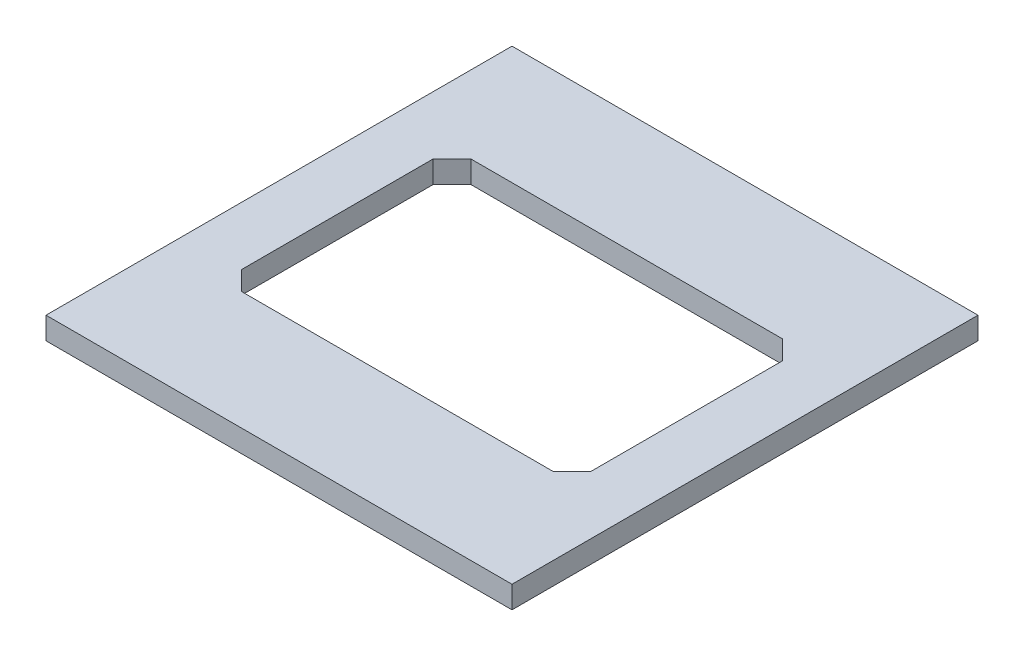
ISO-10303-21;
HEADER;
FILE_DESCRIPTION(('STEP AP214'),'2;1');
FILE_NAME('part.step','',(''),(''),'','','');
FILE_SCHEMA(('AUTOMOTIVE_DESIGN { 1 0 10303 214 1 1 1 1 }'));
ENDSEC;
DATA;
#1=APPLICATION_CONTEXT('core data for automotive mechanical design processes');
#2=APPLICATION_PROTOCOL_DEFINITION('international standard','automotive_design',2000,#1);
#3=PRODUCT_CONTEXT('',#1,'mechanical');
#4=PRODUCT('Part','Part','',(#3));
#5=PRODUCT_RELATED_PRODUCT_CATEGORY('part','',(#4));
#6=PRODUCT_DEFINITION_FORMATION('','',#4);
#7=PRODUCT_DEFINITION_CONTEXT('part definition',#1,'design');
#8=PRODUCT_DEFINITION('design','',#6,#7);
#9=PRODUCT_DEFINITION_SHAPE('','',#8);
#10=(LENGTH_UNIT() NAMED_UNIT(*) SI_UNIT(.MILLI.,.METRE.));
#11=(NAMED_UNIT(*) PLANE_ANGLE_UNIT() SI_UNIT($,.RADIAN.));
#12=(NAMED_UNIT(*) SI_UNIT($,.STERADIAN.) SOLID_ANGLE_UNIT());
#13=UNCERTAINTY_MEASURE_WITH_UNIT(LENGTH_MEASURE(1.E-05),#10,'distance_accuracy_value','');
#14=(GEOMETRIC_REPRESENTATION_CONTEXT(3) GLOBAL_UNCERTAINTY_ASSIGNED_CONTEXT((#13)) GLOBAL_UNIT_ASSIGNED_CONTEXT((#10,
#11,#12)) REPRESENTATION_CONTEXT('',''));
#15=CARTESIAN_POINT('',(0.,0.,0.));
#16=DIRECTION('',(0.,0.,1.));
#17=DIRECTION('',(1.,0.,0.));
#18=AXIS2_PLACEMENT_3D('',#15,#16,#17);
#19=CARTESIAN_POINT('',(-200.,19.05,-200.));
#20=DIRECTION('',(1.,0.,0.));
#21=DIRECTION('',(0.,0.,-1.));
#22=AXIS2_PLACEMENT_3D('',#19,#20,#21);
#23=PLANE('',#22);
#24=DIRECTION('',(0.,0.,1.));
#25=VECTOR('',#24,1.);
#26=CARTESIAN_POINT('',(-200.,0.,-200.));
#27=LINE('',#26,#25);
#28=CARTESIAN_POINT('',(-200.,0.,-200.));
#29=VERTEX_POINT('',#28);
#30=CARTESIAN_POINT('',(-200.,0.,200.));
#31=VERTEX_POINT('',#30);
#32=EDGE_CURVE('E180',#29,#31,#27,.T.);
#33=ORIENTED_EDGE('',*,*,#32,.T.);
#34=DIRECTION('',(0.,-1.,0.));
#35=VECTOR('',#34,1.);
#36=CARTESIAN_POINT('',(-200.,19.05,200.));
#37=LINE('',#36,#35);
#38=CARTESIAN_POINT('',(-200.,19.05,200.));
#39=VERTEX_POINT('',#38);
#40=EDGE_CURVE('E11',#39,#31,#37,.T.);
#41=ORIENTED_EDGE('',*,*,#40,.F.);
#42=DIRECTION('',(0.,0.,1.));
#43=VECTOR('',#42,1.);
#44=CARTESIAN_POINT('',(-200.,19.05,-200.));
#45=LINE('',#44,#43);
#46=CARTESIAN_POINT('',(-200.,19.05,-200.));
#47=VERTEX_POINT('',#46);
#48=EDGE_CURVE('E192',#47,#39,#45,.T.);
#49=ORIENTED_EDGE('',*,*,#48,.F.);
#50=DIRECTION('',(0.,-1.,0.));
#51=VECTOR('',#50,1.);
#52=CARTESIAN_POINT('',(-200.,19.05,-200.));
#53=LINE('',#52,#51);
#54=EDGE_CURVE('E202',#47,#29,#53,.T.);
#55=ORIENTED_EDGE('',*,*,#54,.T.);
#56=EDGE_LOOP('',(#33,#41,#49,#55));
#57=FACE_BOUND('',#56,.T.);
#58=ADVANCED_FACE('F35',(#57),#23,.F.);
#59=CARTESIAN_POINT('',(-200.,19.05,200.));
#60=DIRECTION('',(0.,0.,-1.));
#61=DIRECTION('',(-1.,0.,0.));
#62=AXIS2_PLACEMENT_3D('',#59,#60,#61);
#63=PLANE('',#62);
#64=DIRECTION('',(1.,0.,0.));
#65=VECTOR('',#64,1.);
#66=CARTESIAN_POINT('',(-200.,0.,200.));
#67=LINE('',#66,#65);
#68=CARTESIAN_POINT('',(200.,0.,200.));
#69=VERTEX_POINT('',#68);
#70=EDGE_CURVE('E205',#31,#69,#67,.T.);
#71=ORIENTED_EDGE('',*,*,#70,.T.);
#72=DIRECTION('',(0.,-1.,0.));
#73=VECTOR('',#72,1.);
#74=CARTESIAN_POINT('',(200.,19.05,200.));
#75=LINE('',#74,#73);
#76=CARTESIAN_POINT('',(200.,19.05,200.));
#77=VERTEX_POINT('',#76);
#78=EDGE_CURVE('E42',#77,#69,#75,.T.);
#79=ORIENTED_EDGE('',*,*,#78,.F.);
#80=DIRECTION('',(1.,0.,0.));
#81=VECTOR('',#80,1.);
#82=CARTESIAN_POINT('',(-200.,19.05,200.));
#83=LINE('',#82,#81);
#84=EDGE_CURVE('E195',#39,#77,#83,.T.);
#85=ORIENTED_EDGE('',*,*,#84,.F.);
#86=ORIENTED_EDGE('',*,*,#40,.T.);
#87=EDGE_LOOP('',(#71,#79,#85,#86));
#88=FACE_BOUND('',#87,.T.);
#89=ADVANCED_FACE('F233',(#88),#63,.F.);
#90=CARTESIAN_POINT('',(200.,19.05,-200.));
#91=DIRECTION('',(-1.,0.,0.));
#92=DIRECTION('',(0.,0.,1.));
#93=AXIS2_PLACEMENT_3D('',#90,#91,#92);
#94=PLANE('',#93);
#95=DIRECTION('',(0.,0.,-1.));
#96=VECTOR('',#95,1.);
#97=CARTESIAN_POINT('',(200.,0.,-200.));
#98=LINE('',#97,#96);
#99=CARTESIAN_POINT('',(200.,0.,-200.));
#100=VERTEX_POINT('',#99);
#101=EDGE_CURVE('E207',#69,#100,#98,.T.);
#102=ORIENTED_EDGE('',*,*,#101,.T.);
#103=DIRECTION('',(0.,-1.,0.));
#104=VECTOR('',#103,1.);
#105=CARTESIAN_POINT('',(200.,19.05,-200.));
#106=LINE('',#105,#104);
#107=CARTESIAN_POINT('',(200.,19.05,-200.));
#108=VERTEX_POINT('',#107);
#109=EDGE_CURVE('E212',#108,#100,#106,.T.);
#110=ORIENTED_EDGE('',*,*,#109,.F.);
#111=DIRECTION('',(0.,0.,-1.));
#112=VECTOR('',#111,1.);
#113=CARTESIAN_POINT('',(200.,19.05,-200.));
#114=LINE('',#113,#112);
#115=EDGE_CURVE('E198',#77,#108,#114,.T.);
#116=ORIENTED_EDGE('',*,*,#115,.F.);
#117=ORIENTED_EDGE('',*,*,#78,.T.);
#118=EDGE_LOOP('',(#102,#110,#116,#117));
#119=FACE_BOUND('',#118,.T.);
#120=ADVANCED_FACE('F219',(#119),#94,.F.);
#121=CARTESIAN_POINT('',(-200.,19.05,-200.));
#122=DIRECTION('',(0.,0.,1.));
#123=DIRECTION('',(1.,0.,0.));
#124=AXIS2_PLACEMENT_3D('',#121,#122,#123);
#125=PLANE('',#124);
#126=DIRECTION('',(-1.,0.,0.));
#127=VECTOR('',#126,1.);
#128=CARTESIAN_POINT('',(-200.,0.,-200.));
#129=LINE('',#128,#127);
#130=EDGE_CURVE('E196',#100,#29,#129,.T.);
#131=ORIENTED_EDGE('',*,*,#130,.T.);
#132=ORIENTED_EDGE('',*,*,#54,.F.);
#133=DIRECTION('',(-1.,0.,0.));
#134=VECTOR('',#133,1.);
#135=CARTESIAN_POINT('',(-200.,19.05,-200.));
#136=LINE('',#135,#134);
#137=EDGE_CURVE('E200',#108,#47,#136,.T.);
#138=ORIENTED_EDGE('',*,*,#137,.F.);
#139=ORIENTED_EDGE('',*,*,#109,.T.);
#140=EDGE_LOOP('',(#131,#132,#138,#139));
#141=FACE_BOUND('',#140,.T.);
#142=ADVANCED_FACE('F226',(#141),#125,.F.);
#143=CARTESIAN_POINT('',(0.,19.05,0.));
#144=DIRECTION('',(0.,1.,0.));
#145=DIRECTION('',(0.,0.,1.));
#146=AXIS2_PLACEMENT_3D('',#143,#144,#145);
#147=PLANE('',#146);
#148=DIRECTION('',(0.707106781186548,0.,0.707106781186547));
#149=VECTOR('',#148,1.);
#150=CARTESIAN_POINT('',(-133.736544032709,19.05,98.5));
#151=LINE('',#150,#149);
#152=CARTESIAN_POINT('',(-150.,19.05,82.2365440327094));
#153=VERTEX_POINT('',#152);
#154=CARTESIAN_POINT('',(-133.736544032709,19.05,98.5));
#155=VERTEX_POINT('',#154);
#156=EDGE_CURVE('E49',#153,#155,#151,.T.);
#157=ORIENTED_EDGE('',*,*,#156,.F.);
#158=DIRECTION('',(0.,0.,1.));
#159=VECTOR('',#158,1.);
#160=CARTESIAN_POINT('',(-150.,19.05,82.2365440327094));
#161=LINE('',#160,#159);
#162=CARTESIAN_POINT('',(-150.,19.05,-82.2365440327093));
#163=VERTEX_POINT('',#162);
#164=EDGE_CURVE('E142',#163,#153,#161,.T.);
#165=ORIENTED_EDGE('',*,*,#164,.F.);
#166=DIRECTION('',(-0.707106781186546,0.,0.707106781186549));
#167=VECTOR('',#166,1.);
#168=CARTESIAN_POINT('',(-150.,19.05,-82.2365440327093));
#169=LINE('',#168,#167);
#170=CARTESIAN_POINT('',(-133.736544032709,19.05,-98.5));
#171=VERTEX_POINT('',#170);
#172=EDGE_CURVE('E145',#171,#163,#169,.T.);
#173=ORIENTED_EDGE('',*,*,#172,.F.);
#174=DIRECTION('',(-1.,0.,0.));
#175=VECTOR('',#174,1.);
#176=CARTESIAN_POINT('',(-133.736544032709,19.05,-98.5));
#177=LINE('',#176,#175);
#178=CARTESIAN_POINT('',(133.736544032709,19.05,-98.5));
#179=VERTEX_POINT('',#178);
#180=EDGE_CURVE('E173',#179,#171,#177,.T.);
#181=ORIENTED_EDGE('',*,*,#180,.F.);
#182=DIRECTION('',(-0.707106781186547,0.,-0.707106781186548));
#183=VECTOR('',#182,1.);
#184=CARTESIAN_POINT('',(133.736544032709,19.05,-98.5));
#185=LINE('',#184,#183);
#186=CARTESIAN_POINT('',(150.,19.05,-82.2365440327094));
#187=VERTEX_POINT('',#186);
#188=EDGE_CURVE('E170',#187,#179,#185,.T.);
#189=ORIENTED_EDGE('',*,*,#188,.F.);
#190=DIRECTION('',(0.,0.,-1.));
#191=VECTOR('',#190,1.);
#192=CARTESIAN_POINT('',(150.,19.05,-82.2365440327094));
#193=LINE('',#192,#191);
#194=CARTESIAN_POINT('',(150.,19.05,82.2365440327094));
#195=VERTEX_POINT('',#194);
#196=EDGE_CURVE('E167',#195,#187,#193,.T.);
#197=ORIENTED_EDGE('',*,*,#196,.F.);
#198=DIRECTION('',(0.707106781186547,0.,-0.707106781186548));
#199=VECTOR('',#198,1.);
#200=CARTESIAN_POINT('',(150.,19.05,82.2365440327094));
#201=LINE('',#200,#199);
#202=CARTESIAN_POINT('',(133.736544032709,19.05,98.5));
#203=VERTEX_POINT('',#202);
#204=EDGE_CURVE('E164',#203,#195,#201,.T.);
#205=ORIENTED_EDGE('',*,*,#204,.F.);
#206=DIRECTION('',(1.,0.,0.));
#207=VECTOR('',#206,1.);
#208=CARTESIAN_POINT('',(133.736544032709,19.05,98.5));
#209=LINE('',#208,#207);
#210=EDGE_CURVE('E162',#155,#203,#209,.T.);
#211=ORIENTED_EDGE('',*,*,#210,.F.);
#212=EDGE_LOOP('',(#157,#165,#173,#181,#189,#197,#205,#211));
#213=FACE_BOUND('',#212,.T.);
#214=ORIENTED_EDGE('',*,*,#48,.T.);
#215=ORIENTED_EDGE('',*,*,#84,.T.);
#216=ORIENTED_EDGE('',*,*,#115,.T.);
#217=ORIENTED_EDGE('',*,*,#137,.T.);
#218=EDGE_LOOP('',(#214,#215,#216,#217));
#219=FACE_BOUND('',#218,.T.);
#220=ADVANCED_FACE('F232',(#213,#219),#147,.T.);
#221=CARTESIAN_POINT('',(0.,0.,0.));
#222=DIRECTION('',(0.,1.,0.));
#223=DIRECTION('',(0.,0.,1.));
#224=AXIS2_PLACEMENT_3D('',#221,#222,#223);
#225=PLANE('',#224);
#226=DIRECTION('',(0.,0.,1.));
#227=VECTOR('',#226,1.);
#228=CARTESIAN_POINT('',(-150.,0.,82.2365440327094));
#229=LINE('',#228,#227);
#230=CARTESIAN_POINT('',(-150.,0.,-82.2365440327093));
#231=VERTEX_POINT('',#230);
#232=CARTESIAN_POINT('',(-150.,0.,82.2365440327094));
#233=VERTEX_POINT('',#232);
#234=EDGE_CURVE('E131',#231,#233,#229,.T.);
#235=ORIENTED_EDGE('',*,*,#234,.T.);
#236=DIRECTION('',(0.707106781186548,0.,0.707106781186547));
#237=VECTOR('',#236,1.);
#238=CARTESIAN_POINT('',(-133.736544032709,0.,98.5));
#239=LINE('',#238,#237);
#240=CARTESIAN_POINT('',(-133.736544032709,0.,98.5));
#241=VERTEX_POINT('',#240);
#242=EDGE_CURVE('E125',#233,#241,#239,.T.);
#243=ORIENTED_EDGE('',*,*,#242,.T.);
#244=DIRECTION('',(1.,0.,0.));
#245=VECTOR('',#244,1.);
#246=CARTESIAN_POINT('',(133.736544032709,0.,98.5));
#247=LINE('',#246,#245);
#248=CARTESIAN_POINT('',(133.736544032709,0.,98.5));
#249=VERTEX_POINT('',#248);
#250=EDGE_CURVE('E134',#241,#249,#247,.T.);
#251=ORIENTED_EDGE('',*,*,#250,.T.);
#252=DIRECTION('',(0.707106781186547,0.,-0.707106781186548));
#253=VECTOR('',#252,1.);
#254=CARTESIAN_POINT('',(150.,0.,82.2365440327094));
#255=LINE('',#254,#253);
#256=CARTESIAN_POINT('',(150.,0.,82.2365440327094));
#257=VERTEX_POINT('',#256);
#258=EDGE_CURVE('E57',#249,#257,#255,.T.);
#259=ORIENTED_EDGE('',*,*,#258,.T.);
#260=DIRECTION('',(0.,0.,-1.));
#261=VECTOR('',#260,1.);
#262=CARTESIAN_POINT('',(150.,0.,-82.2365440327094));
#263=LINE('',#262,#261);
#264=CARTESIAN_POINT('',(150.,0.,-82.2365440327094));
#265=VERTEX_POINT('',#264);
#266=EDGE_CURVE('E149',#257,#265,#263,.T.);
#267=ORIENTED_EDGE('',*,*,#266,.T.);
#268=DIRECTION('',(-0.707106781186547,0.,-0.707106781186548));
#269=VECTOR('',#268,1.);
#270=CARTESIAN_POINT('',(133.736544032709,0.,-98.5));
#271=LINE('',#270,#269);
#272=CARTESIAN_POINT('',(133.736544032709,0.,-98.5));
#273=VERTEX_POINT('',#272);
#274=EDGE_CURVE('E152',#265,#273,#271,.T.);
#275=ORIENTED_EDGE('',*,*,#274,.T.);
#276=DIRECTION('',(-1.,0.,0.));
#277=VECTOR('',#276,1.);
#278=CARTESIAN_POINT('',(-133.736544032709,0.,-98.5));
#279=LINE('',#278,#277);
#280=CARTESIAN_POINT('',(-133.736544032709,0.,-98.5));
#281=VERTEX_POINT('',#280);
#282=EDGE_CURVE('E155',#273,#281,#279,.T.);
#283=ORIENTED_EDGE('',*,*,#282,.T.);
#284=DIRECTION('',(-0.707106781186546,0.,0.707106781186549));
#285=VECTOR('',#284,1.);
#286=CARTESIAN_POINT('',(-150.,0.,-82.2365440327093));
#287=LINE('',#286,#285);
#288=EDGE_CURVE('E158',#281,#231,#287,.T.);
#289=ORIENTED_EDGE('',*,*,#288,.T.);
#290=EDGE_LOOP('',(#235,#243,#251,#259,#267,#275,#283,#289));
#291=FACE_BOUND('',#290,.T.);
#292=ORIENTED_EDGE('',*,*,#32,.F.);
#293=ORIENTED_EDGE('',*,*,#130,.F.);
#294=ORIENTED_EDGE('',*,*,#101,.F.);
#295=ORIENTED_EDGE('',*,*,#70,.F.);
#296=EDGE_LOOP('',(#292,#293,#294,#295));
#297=FACE_BOUND('',#296,.T.);
#298=ADVANCED_FACE('F138',(#291,#297),#225,.F.);
#299=CARTESIAN_POINT('',(-133.736544032709,0.,98.5));
#300=DIRECTION('',(-0.707106781186547,0.,0.707106781186548));
#301=DIRECTION('',(0.707106781186548,0.,0.707106781186547));
#302=AXIS2_PLACEMENT_3D('',#299,#300,#301);
#303=PLANE('',#302);
#304=ORIENTED_EDGE('',*,*,#156,.T.);
#305=DIRECTION('',(0.,1.,0.));
#306=VECTOR('',#305,1.);
#307=CARTESIAN_POINT('',(-133.736544032709,0.,98.5));
#308=LINE('',#307,#306);
#309=EDGE_CURVE('E121',#241,#155,#308,.T.);
#310=ORIENTED_EDGE('',*,*,#309,.F.);
#311=ORIENTED_EDGE('',*,*,#242,.F.);
#312=DIRECTION('',(0.,1.,0.));
#313=VECTOR('',#312,1.);
#314=CARTESIAN_POINT('',(-150.,0.,82.2365440327094));
#315=LINE('',#314,#313);
#316=EDGE_CURVE('E178',#233,#153,#315,.T.);
#317=ORIENTED_EDGE('',*,*,#316,.T.);
#318=EDGE_LOOP('',(#304,#310,#311,#317));
#319=FACE_BOUND('',#318,.T.);
#320=ADVANCED_FACE('F123',(#319),#303,.F.);
#321=CARTESIAN_POINT('',(-150.,0.,82.2365440327094));
#322=DIRECTION('',(-1.,0.,0.));
#323=DIRECTION('',(0.,0.,1.));
#324=AXIS2_PLACEMENT_3D('',#321,#322,#323);
#325=PLANE('',#324);
#326=ORIENTED_EDGE('',*,*,#164,.T.);
#327=ORIENTED_EDGE('',*,*,#316,.F.);
#328=ORIENTED_EDGE('',*,*,#234,.F.);
#329=DIRECTION('',(0.,1.,0.));
#330=VECTOR('',#329,1.);
#331=CARTESIAN_POINT('',(-150.,0.,-82.2365440327093));
#332=LINE('',#331,#330);
#333=EDGE_CURVE('E181',#231,#163,#332,.T.);
#334=ORIENTED_EDGE('',*,*,#333,.T.);
#335=EDGE_LOOP('',(#326,#327,#328,#334));
#336=FACE_BOUND('',#335,.T.);
#337=ADVANCED_FACE('F250',(#336),#325,.F.);
#338=CARTESIAN_POINT('',(-150.,0.,-82.2365440327093));
#339=DIRECTION('',(-0.707106781186549,0.,-0.707106781186546));
#340=DIRECTION('',(-0.707106781186546,0.,0.707106781186549));
#341=AXIS2_PLACEMENT_3D('',#338,#339,#340);
#342=PLANE('',#341);
#343=ORIENTED_EDGE('',*,*,#172,.T.);
#344=ORIENTED_EDGE('',*,*,#333,.F.);
#345=ORIENTED_EDGE('',*,*,#288,.F.);
#346=DIRECTION('',(0.,1.,0.));
#347=VECTOR('',#346,1.);
#348=CARTESIAN_POINT('',(-133.736544032709,0.,-98.5));
#349=LINE('',#348,#347);
#350=EDGE_CURVE('E183',#281,#171,#349,.T.);
#351=ORIENTED_EDGE('',*,*,#350,.T.);
#352=EDGE_LOOP('',(#343,#344,#345,#351));
#353=FACE_BOUND('',#352,.T.);
#354=ADVANCED_FACE('F267',(#353),#342,.F.);
#355=CARTESIAN_POINT('',(-133.736544032709,0.,-98.5));
#356=DIRECTION('',(0.,0.,-1.));
#357=DIRECTION('',(-1.,0.,0.));
#358=AXIS2_PLACEMENT_3D('',#355,#356,#357);
#359=PLANE('',#358);
#360=ORIENTED_EDGE('',*,*,#180,.T.);
#361=ORIENTED_EDGE('',*,*,#350,.F.);
#362=ORIENTED_EDGE('',*,*,#282,.F.);
#363=DIRECTION('',(0.,1.,0.));
#364=VECTOR('',#363,1.);
#365=CARTESIAN_POINT('',(133.736544032709,0.,-98.5));
#366=LINE('',#365,#364);
#367=EDGE_CURVE('E185',#273,#179,#366,.T.);
#368=ORIENTED_EDGE('',*,*,#367,.T.);
#369=EDGE_LOOP('',(#360,#361,#362,#368));
#370=FACE_BOUND('',#369,.T.);
#371=ADVANCED_FACE('F263',(#370),#359,.F.);
#372=CARTESIAN_POINT('',(133.736544032709,0.,-98.5));
#373=DIRECTION('',(0.707106781186548,0.,-0.707106781186547));
#374=DIRECTION('',(-0.707106781186547,0.,-0.707106781186548));
#375=AXIS2_PLACEMENT_3D('',#372,#373,#374);
#376=PLANE('',#375);
#377=ORIENTED_EDGE('',*,*,#188,.T.);
#378=ORIENTED_EDGE('',*,*,#367,.F.);
#379=ORIENTED_EDGE('',*,*,#274,.F.);
#380=DIRECTION('',(0.,1.,0.));
#381=VECTOR('',#380,1.);
#382=CARTESIAN_POINT('',(150.,0.,-82.2365440327094));
#383=LINE('',#382,#381);
#384=EDGE_CURVE('E187',#265,#187,#383,.T.);
#385=ORIENTED_EDGE('',*,*,#384,.T.);
#386=EDGE_LOOP('',(#377,#378,#379,#385));
#387=FACE_BOUND('',#386,.T.);
#388=ADVANCED_FACE('F259',(#387),#376,.F.);
#389=CARTESIAN_POINT('',(150.,0.,-82.2365440327094));
#390=DIRECTION('',(1.,0.,0.));
#391=DIRECTION('',(0.,0.,-1.));
#392=AXIS2_PLACEMENT_3D('',#389,#390,#391);
#393=PLANE('',#392);
#394=ORIENTED_EDGE('',*,*,#196,.T.);
#395=ORIENTED_EDGE('',*,*,#384,.F.);
#396=ORIENTED_EDGE('',*,*,#266,.F.);
#397=DIRECTION('',(0.,1.,0.));
#398=VECTOR('',#397,1.);
#399=CARTESIAN_POINT('',(150.,0.,82.2365440327094));
#400=LINE('',#399,#398);
#401=EDGE_CURVE('E189',#257,#195,#400,.T.);
#402=ORIENTED_EDGE('',*,*,#401,.T.);
#403=EDGE_LOOP('',(#394,#395,#396,#402));
#404=FACE_BOUND('',#403,.T.);
#405=ADVANCED_FACE('F256',(#404),#393,.F.);
#406=CARTESIAN_POINT('',(150.,0.,82.2365440327094));
#407=DIRECTION('',(0.707106781186548,0.,0.707106781186547));
#408=DIRECTION('',(0.707106781186547,0.,-0.707106781186548));
#409=AXIS2_PLACEMENT_3D('',#406,#407,#408);
#410=PLANE('',#409);
#411=ORIENTED_EDGE('',*,*,#204,.T.);
#412=ORIENTED_EDGE('',*,*,#401,.F.);
#413=ORIENTED_EDGE('',*,*,#258,.F.);
#414=DIRECTION('',(0.,1.,0.));
#415=VECTOR('',#414,1.);
#416=CARTESIAN_POINT('',(133.736544032709,0.,98.5));
#417=LINE('',#416,#415);
#418=EDGE_CURVE('E130',#249,#203,#417,.T.);
#419=ORIENTED_EDGE('',*,*,#418,.T.);
#420=EDGE_LOOP('',(#411,#412,#413,#419));
#421=FACE_BOUND('',#420,.T.);
#422=ADVANCED_FACE('F253',(#421),#410,.F.);
#423=CARTESIAN_POINT('',(133.736544032709,0.,98.5));
#424=DIRECTION('',(0.,0.,1.));
#425=DIRECTION('',(1.,0.,0.));
#426=AXIS2_PLACEMENT_3D('',#423,#424,#425);
#427=PLANE('',#426);
#428=ORIENTED_EDGE('',*,*,#210,.T.);
#429=ORIENTED_EDGE('',*,*,#418,.F.);
#430=ORIENTED_EDGE('',*,*,#250,.F.);
#431=ORIENTED_EDGE('',*,*,#309,.T.);
#432=EDGE_LOOP('',(#428,#429,#430,#431));
#433=FACE_BOUND('',#432,.T.);
#434=ADVANCED_FACE('F135',(#433),#427,.F.);
#435=CLOSED_SHELL('',(#58,#89,#120,#142,#220,#298,#320,#337,#354,#371,#388,#405,#422,#434));
#436=MANIFOLD_SOLID_BREP('B2',#435);
#437=ADVANCED_BREP_SHAPE_REPRESENTATION('',(#18,#436),#14);
#438=SHAPE_DEFINITION_REPRESENTATION(#9,#437);
ENDSEC;
END-ISO-10303-21;
